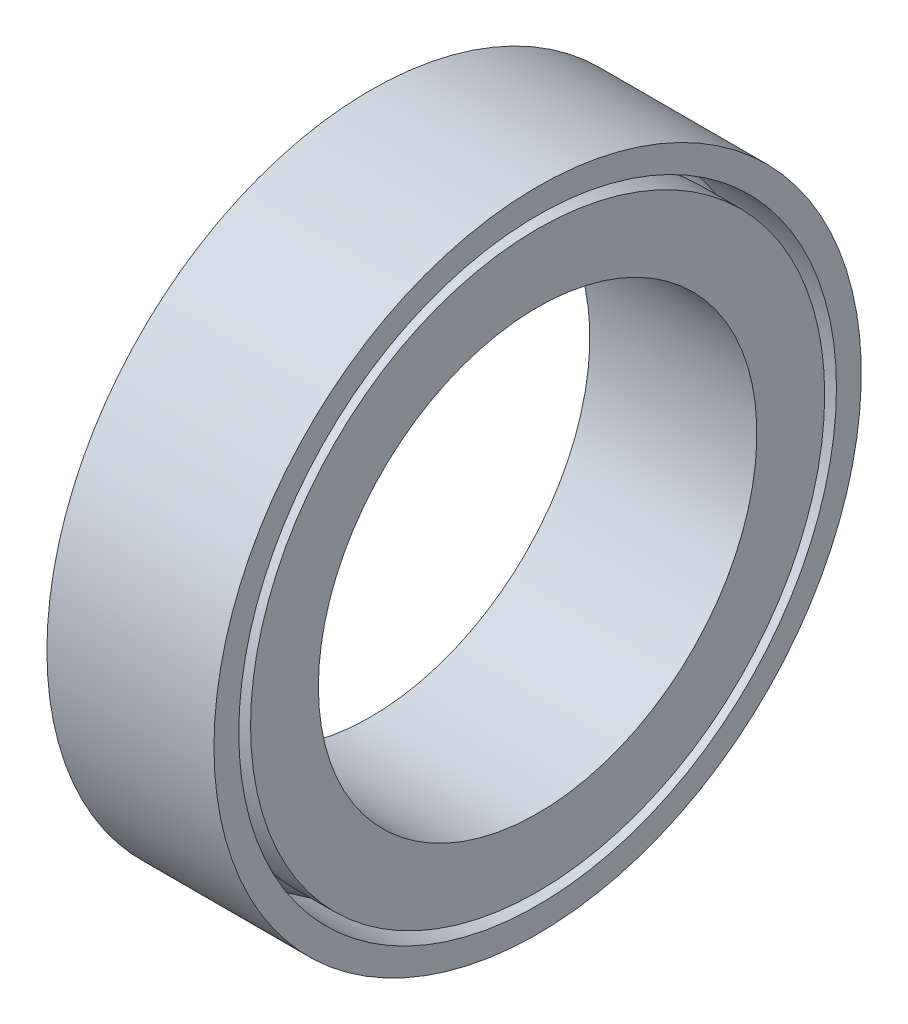
ISO-10303-21;
HEADER;
FILE_DESCRIPTION(('STEP AP214'),'2;1');
FILE_NAME('part.step','',(''),(''),'','','');
FILE_SCHEMA(('AUTOMOTIVE_DESIGN { 1 0 10303 214 1 1 1 1 }'));
ENDSEC;
DATA;
#1=APPLICATION_CONTEXT('core data for automotive mechanical design processes');
#2=APPLICATION_PROTOCOL_DEFINITION('international standard','automotive_design',2000,#1);
#3=PRODUCT_CONTEXT('',#1,'mechanical');
#4=PRODUCT('Part','Part','',(#3));
#5=PRODUCT_RELATED_PRODUCT_CATEGORY('part','',(#4));
#6=PRODUCT_DEFINITION_FORMATION('','',#4);
#7=PRODUCT_DEFINITION_CONTEXT('part definition',#1,'design');
#8=PRODUCT_DEFINITION('design','',#6,#7);
#9=PRODUCT_DEFINITION_SHAPE('','',#8);
#10=(LENGTH_UNIT() NAMED_UNIT(*) SI_UNIT(.MILLI.,.METRE.));
#11=(NAMED_UNIT(*) PLANE_ANGLE_UNIT() SI_UNIT($,.RADIAN.));
#12=(NAMED_UNIT(*) SI_UNIT($,.STERADIAN.) SOLID_ANGLE_UNIT());
#13=UNCERTAINTY_MEASURE_WITH_UNIT(LENGTH_MEASURE(1.E-05),#10,'distance_accuracy_value','');
#14=(GEOMETRIC_REPRESENTATION_CONTEXT(3) GLOBAL_UNCERTAINTY_ASSIGNED_CONTEXT((#13)) GLOBAL_UNIT_ASSIGNED_CONTEXT((#10,
#11,#12)) REPRESENTATION_CONTEXT('',''));
#15=CARTESIAN_POINT('',(0.,0.,0.));
#16=DIRECTION('',(0.,0.,1.));
#17=DIRECTION('',(1.,0.,0.));
#18=AXIS2_PLACEMENT_3D('',#15,#16,#17);
#19=CARTESIAN_POINT('',(4.40930411466044,0.,0.));
#20=DIRECTION('',(-1.,0.,0.));
#21=DIRECTION('',(0.,0.,1.));
#22=AXIS2_PLACEMENT_3D('',#19,#20,#21);
#23=TOROIDAL_SURFACE('',#22,13.0812520137776,1.04110815053601);
#24=CARTESIAN_POINT('',(4.59047957305531,0.,0.));
#25=DIRECTION('',(-1.,0.,0.));
#26=DIRECTION('',(0.,0.,1.));
#27=AXIS2_PLACEMENT_3D('',#24,#25,#26);
#28=CIRCLE('',#27,12.0560292894938);
#29=CARTESIAN_POINT('',(4.59047957305531,0.,12.0560292894938));
#30=VERTEX_POINT('',#29);
#31=EDGE_CURVE('E83',#30,#30,#28,.T.);
#32=ORIENTED_EDGE('',*,*,#31,.T.);
#33=EDGE_LOOP('',(#32));
#34=FACE_BOUND('',#33,.T.);
#35=CARTESIAN_POINT('',(4.22812865626557,0.,0.));
#36=DIRECTION('',(-1.,0.,0.));
#37=DIRECTION('',(0.,0.,1.));
#38=AXIS2_PLACEMENT_3D('',#35,#36,#37);
#39=CIRCLE('',#38,12.0560292894938);
#40=CARTESIAN_POINT('',(4.22812865626557,0.,12.0560292894938));
#41=VERTEX_POINT('',#40);
#42=EDGE_CURVE('E11',#41,#41,#39,.T.);
#43=ORIENTED_EDGE('',*,*,#42,.F.);
#44=EDGE_LOOP('',(#43));
#45=FACE_BOUND('',#44,.T.);
#46=ADVANCED_FACE('F43',(#34,#45),#23,.F.);
#47=CARTESIAN_POINT('',(0.,0.,0.));
#48=DIRECTION('',(-1.,0.,0.));
#49=DIRECTION('',(0.,0.,1.));
#50=AXIS2_PLACEMENT_3D('',#47,#48,#49);
#51=CYLINDRICAL_SURFACE('',#50,12.0560292894938);
#52=ORIENTED_EDGE('',*,*,#42,.T.);
#53=EDGE_LOOP('',(#52));
#54=FACE_BOUND('',#53,.T.);
#55=CARTESIAN_POINT('',(2.78968179939985,0.,0.));
#56=DIRECTION('',(-1.,0.,0.));
#57=DIRECTION('',(0.,0.,1.));
#58=AXIS2_PLACEMENT_3D('',#55,#56,#57);
#59=CIRCLE('',#58,12.0560292894938);
#60=CARTESIAN_POINT('',(2.78968179939985,0.,12.0560292894938));
#61=VERTEX_POINT('',#60);
#62=EDGE_CURVE('E49',#61,#61,#59,.T.);
#63=ORIENTED_EDGE('',*,*,#62,.F.);
#64=EDGE_LOOP('',(#63));
#65=FACE_BOUND('',#64,.T.);
#66=ADVANCED_FACE('F94',(#54,#65),#51,.T.);
#67=CARTESIAN_POINT('',(2.78968179939985,0.,0.));
#68=DIRECTION('',(1.,0.,0.));
#69=DIRECTION('',(0.,0.,-1.));
#70=AXIS2_PLACEMENT_3D('',#67,#68,#69);
#71=PLANE('',#70);
#72=ORIENTED_EDGE('',*,*,#62,.T.);
#73=EDGE_LOOP('',(#72));
#74=FACE_BOUND('',#73,.T.);
#75=CARTESIAN_POINT('',(2.78968179939985,0.,0.));
#76=DIRECTION('',(-1.,0.,0.));
#77=DIRECTION('',(0.,0.,1.));
#78=AXIS2_PLACEMENT_3D('',#75,#76,#77);
#79=CIRCLE('',#78,14.3120731788156);
#80=CARTESIAN_POINT('',(2.78968179939985,0.,14.3120731788156));
#81=VERTEX_POINT('',#80);
#82=EDGE_CURVE('E53',#81,#81,#79,.T.);
#83=ORIENTED_EDGE('',*,*,#82,.F.);
#84=EDGE_LOOP('',(#83));
#85=FACE_BOUND('',#84,.T.);
#86=ADVANCED_FACE('F102',(#74,#85),#71,.T.);
#87=CARTESIAN_POINT('',(0.,0.,0.));
#88=DIRECTION('',(-1.,0.,0.));
#89=DIRECTION('',(0.,0.,1.));
#90=AXIS2_PLACEMENT_3D('',#87,#88,#89);
#91=CYLINDRICAL_SURFACE('',#90,14.3120731788156);
#92=ORIENTED_EDGE('',*,*,#82,.T.);
#93=EDGE_LOOP('',(#92));
#94=FACE_BOUND('',#93,.T.);
#95=CARTESIAN_POINT('',(8.,0.,0.));
#96=DIRECTION('',(-1.,0.,0.));
#97=DIRECTION('',(0.,0.,1.));
#98=AXIS2_PLACEMENT_3D('',#95,#96,#97);
#99=CIRCLE('',#98,14.3120731788156);
#100=CARTESIAN_POINT('',(8.,0.,14.3120731788156));
#101=VERTEX_POINT('',#100);
#102=EDGE_CURVE('E57',#101,#101,#99,.T.);
#103=ORIENTED_EDGE('',*,*,#102,.F.);
#104=EDGE_LOOP('',(#103));
#105=FACE_BOUND('',#104,.T.);
#106=ADVANCED_FACE('F116',(#94,#105),#91,.F.);
#107=CARTESIAN_POINT('',(8.,0.,0.));
#108=DIRECTION('',(1.,0.,0.));
#109=DIRECTION('',(0.,0.,-1.));
#110=AXIS2_PLACEMENT_3D('',#107,#108,#109);
#111=PLANE('',#110);
#112=ORIENTED_EDGE('',*,*,#102,.T.);
#113=EDGE_LOOP('',(#112));
#114=FACE_BOUND('',#113,.T.);
#115=CARTESIAN_POINT('',(8.,0.,0.));
#116=DIRECTION('',(-1.,0.,0.));
#117=DIRECTION('',(0.,0.,1.));
#118=AXIS2_PLACEMENT_3D('',#115,#116,#117);
#119=CIRCLE('',#118,15.5);
#120=CARTESIAN_POINT('',(8.,0.,15.5));
#121=VERTEX_POINT('',#120);
#122=EDGE_CURVE('E62',#121,#121,#119,.T.);
#123=ORIENTED_EDGE('',*,*,#122,.F.);
#124=EDGE_LOOP('',(#123));
#125=FACE_BOUND('',#124,.T.);
#126=ADVANCED_FACE('F122',(#114,#125),#111,.T.);
#127=CARTESIAN_POINT('',(0.,0.,0.));
#128=DIRECTION('',(-1.,0.,0.));
#129=DIRECTION('',(0.,0.,1.));
#130=AXIS2_PLACEMENT_3D('',#127,#128,#129);
#131=CYLINDRICAL_SURFACE('',#130,15.5);
#132=ORIENTED_EDGE('',*,*,#122,.T.);
#133=EDGE_LOOP('',(#132));
#134=FACE_BOUND('',#133,.T.);
#135=CARTESIAN_POINT('',(0.,0.,0.));
#136=DIRECTION('',(-1.,0.,0.));
#137=DIRECTION('',(0.,0.,1.));
#138=AXIS2_PLACEMENT_3D('',#135,#136,#137);
#139=CIRCLE('',#138,15.5);
#140=CARTESIAN_POINT('',(0.,0.,15.5));
#141=VERTEX_POINT('',#140);
#142=EDGE_CURVE('E65',#141,#141,#139,.T.);
#143=ORIENTED_EDGE('',*,*,#142,.F.);
#144=EDGE_LOOP('',(#143));
#145=FACE_BOUND('',#144,.T.);
#146=ADVANCED_FACE('F130',(#134,#145),#131,.T.);
#147=CARTESIAN_POINT('',(0.,0.,0.));
#148=DIRECTION('',(-1.,0.,0.));
#149=DIRECTION('',(0.,0.,1.));
#150=AXIS2_PLACEMENT_3D('',#147,#148,#149);
#151=PLANE('',#150);
#152=ORIENTED_EDGE('',*,*,#142,.T.);
#153=EDGE_LOOP('',(#152));
#154=FACE_BOUND('',#153,.T.);
#155=CARTESIAN_POINT('',(0.,0.,0.));
#156=DIRECTION('',(-1.,0.,0.));
#157=DIRECTION('',(0.,0.,1.));
#158=AXIS2_PLACEMENT_3D('',#155,#156,#157);
#159=CIRCLE('',#158,10.5);
#160=CARTESIAN_POINT('',(0.,0.,10.5));
#161=VERTEX_POINT('',#160);
#162=EDGE_CURVE('E68',#161,#161,#159,.T.);
#163=ORIENTED_EDGE('',*,*,#162,.F.);
#164=EDGE_LOOP('',(#163));
#165=FACE_BOUND('',#164,.T.);
#166=ADVANCED_FACE('F138',(#154,#165),#151,.T.);
#167=CARTESIAN_POINT('',(0.,0.,0.));
#168=DIRECTION('',(-1.,0.,0.));
#169=DIRECTION('',(0.,0.,1.));
#170=AXIS2_PLACEMENT_3D('',#167,#168,#169);
#171=CYLINDRICAL_SURFACE('',#170,10.5);
#172=ORIENTED_EDGE('',*,*,#162,.T.);
#173=EDGE_LOOP('',(#172));
#174=FACE_BOUND('',#173,.T.);
#175=CARTESIAN_POINT('',(8.,0.,0.));
#176=DIRECTION('',(-1.,0.,0.));
#177=DIRECTION('',(0.,0.,1.));
#178=AXIS2_PLACEMENT_3D('',#175,#176,#177);
#179=CIRCLE('',#178,10.5);
#180=CARTESIAN_POINT('',(8.,0.,10.5));
#181=VERTEX_POINT('',#180);
#182=EDGE_CURVE('E71',#181,#181,#179,.T.);
#183=ORIENTED_EDGE('',*,*,#182,.F.);
#184=EDGE_LOOP('',(#183));
#185=FACE_BOUND('',#184,.T.);
#186=ADVANCED_FACE('F146',(#174,#185),#171,.F.);
#187=CARTESIAN_POINT('',(8.,0.,0.));
#188=DIRECTION('',(1.,0.,0.));
#189=DIRECTION('',(0.,0.,-1.));
#190=AXIS2_PLACEMENT_3D('',#187,#188,#189);
#191=PLANE('',#190);
#192=ORIENTED_EDGE('',*,*,#182,.T.);
#193=EDGE_LOOP('',(#192));
#194=FACE_BOUND('',#193,.T.);
#195=CARTESIAN_POINT('',(8.,0.,0.));
#196=DIRECTION('',(-1.,0.,0.));
#197=DIRECTION('',(0.,0.,1.));
#198=AXIS2_PLACEMENT_3D('',#195,#196,#197);
#199=CIRCLE('',#198,13.7476363803436);
#200=CARTESIAN_POINT('',(8.,0.,13.7476363803436));
#201=VERTEX_POINT('',#200);
#202=EDGE_CURVE('E74',#201,#201,#199,.T.);
#203=ORIENTED_EDGE('',*,*,#202,.F.);
#204=EDGE_LOOP('',(#203));
#205=FACE_BOUND('',#204,.T.);
#206=ADVANCED_FACE('F154',(#194,#205),#191,.T.);
#207=CARTESIAN_POINT('',(0.,0.,0.));
#208=DIRECTION('',(-1.,0.,0.));
#209=DIRECTION('',(0.,0.,1.));
#210=AXIS2_PLACEMENT_3D('',#207,#208,#209);
#211=CYLINDRICAL_SURFACE('',#210,13.7476363803436);
#212=ORIENTED_EDGE('',*,*,#202,.T.);
#213=EDGE_LOOP('',(#212));
#214=FACE_BOUND('',#213,.T.);
#215=CARTESIAN_POINT('',(5.98225828253965,0.,0.));
#216=DIRECTION('',(-1.,0.,0.));
#217=DIRECTION('',(0.,0.,1.));
#218=AXIS2_PLACEMENT_3D('',#215,#216,#217);
#219=CIRCLE('',#218,13.7476363803436);
#220=CARTESIAN_POINT('',(5.98225828253965,0.,13.7476363803436));
#221=VERTEX_POINT('',#220);
#222=EDGE_CURVE('E77',#221,#221,#219,.T.);
#223=ORIENTED_EDGE('',*,*,#222,.F.);
#224=EDGE_LOOP('',(#223));
#225=FACE_BOUND('',#224,.T.);
#226=ADVANCED_FACE('F98',(#214,#225),#211,.T.);
#227=CARTESIAN_POINT('',(5.98225828253965,0.,0.));
#228=DIRECTION('',(1.,0.,0.));
#229=DIRECTION('',(0.,0.,-1.));
#230=AXIS2_PLACEMENT_3D('',#227,#228,#229);
#231=PLANE('',#230);
#232=CARTESIAN_POINT('',(5.98225828253965,0.,0.));
#233=DIRECTION('',(-1.,0.,0.));
#234=DIRECTION('',(0.,0.,1.));
#235=AXIS2_PLACEMENT_3D('',#232,#233,#234);
#236=CIRCLE('',#235,12.0560292894938);
#237=CARTESIAN_POINT('',(5.98225828253965,0.,12.0560292894938));
#238=VERTEX_POINT('',#237);
#239=EDGE_CURVE('E80',#238,#238,#236,.T.);
#240=ORIENTED_EDGE('',*,*,#239,.F.);
#241=EDGE_LOOP('',(#240));
#242=FACE_BOUND('',#241,.T.);
#243=ORIENTED_EDGE('',*,*,#222,.T.);
#244=EDGE_LOOP('',(#243));
#245=FACE_BOUND('',#244,.T.);
#246=ADVANCED_FACE('F91',(#242,#245),#231,.F.);
#247=ORIENTED_EDGE('',*,*,#239,.T.);
#248=EDGE_LOOP('',(#247));
#249=FACE_BOUND('',#248,.T.);
#250=ORIENTED_EDGE('',*,*,#31,.F.);
#251=EDGE_LOOP('',(#250));
#252=FACE_BOUND('',#251,.T.);
#253=ADVANCED_FACE('F89',(#249,#252),#51,.T.);
#254=CLOSED_SHELL('',(#46,#66,#86,#106,#126,#146,#166,#186,#206,#226,#246,#253));
#255=MANIFOLD_SOLID_BREP('B2',#254);
#256=CARTESIAN_POINT('',(0.,0.,0.));
#257=DIRECTION('',(-1.,0.,0.));
#258=DIRECTION('',(0.,0.,1.));
#259=AXIS2_PLACEMENT_3D('',#256,#257,#258);
#260=CYLINDRICAL_SURFACE('',#259,12.0560292894938);
#261=CARTESIAN_POINT('',(4.59047957305531,0.,0.));
#262=DIRECTION('',(-1.,0.,0.));
#263=DIRECTION('',(0.,0.,1.));
#264=AXIS2_PLACEMENT_3D('',#261,#262,#263);
#265=CIRCLE('',#264,12.0560292894938);
#266=CARTESIAN_POINT('',(4.59047957305531,0.,12.0560292894938));
#267=VERTEX_POINT('',#266);
#268=EDGE_CURVE('E42',#267,#267,#265,.T.);
#269=ORIENTED_EDGE('',*,*,#268,.F.);
#270=EDGE_LOOP('',(#269));
#271=FACE_BOUND('',#270,.T.);
#272=CARTESIAN_POINT('',(4.22812865626557,0.,0.));
#273=DIRECTION('',(-1.,0.,0.));
#274=DIRECTION('',(0.,0.,1.));
#275=AXIS2_PLACEMENT_3D('',#272,#273,#274);
#276=CIRCLE('',#275,12.0560292894938);
#277=CARTESIAN_POINT('',(4.22812865626557,0.,12.0560292894938));
#278=VERTEX_POINT('',#277);
#279=EDGE_CURVE('E233',#278,#278,#276,.T.);
#280=ORIENTED_EDGE('',*,*,#279,.T.);
#281=EDGE_LOOP('',(#280));
#282=FACE_BOUND('',#281,.T.);
#283=ADVANCED_FACE('F227',(#271,#282),#260,.F.);
#284=CARTESIAN_POINT('',(4.40930411466044,0.,0.));
#285=DIRECTION('',(-1.,0.,0.));
#286=DIRECTION('',(0.,0.,1.));
#287=AXIS2_PLACEMENT_3D('',#284,#285,#286);
#288=TOROIDAL_SURFACE('',#287,13.0812520137776,1.04110815053601);
#289=ORIENTED_EDGE('',*,*,#279,.F.);
#290=EDGE_LOOP('',(#289));
#291=FACE_BOUND('',#290,.T.);
#292=ORIENTED_EDGE('',*,*,#268,.T.);
#293=EDGE_LOOP('',(#292));
#294=FACE_BOUND('',#293,.T.);
#295=ADVANCED_FACE('F240',(#291,#294),#288,.T.);
#296=CLOSED_SHELL('',(#283,#295));
#297=MANIFOLD_SOLID_BREP('B6',#296);
#298=ADVANCED_BREP_SHAPE_REPRESENTATION('',(#18,#255,#297),#14);
#299=SHAPE_DEFINITION_REPRESENTATION(#9,#298);
ENDSEC;
END-ISO-10303-21;
